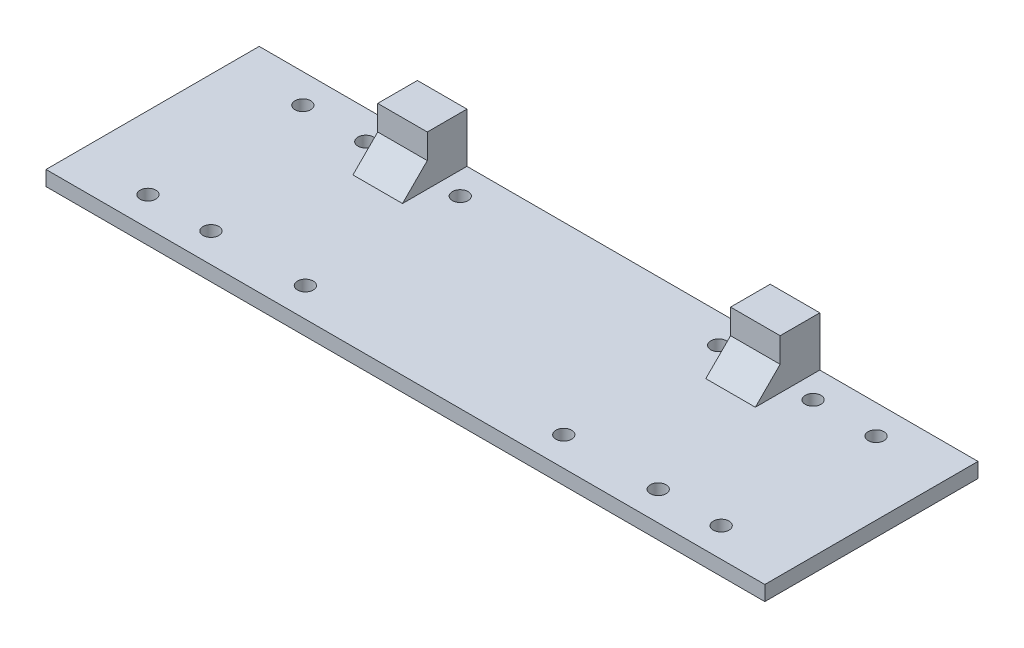
ISO-10303-21;
HEADER;
FILE_DESCRIPTION(('STEP AP214'),'2;1');
FILE_NAME('part.step','',(''),(''),'','','');
FILE_SCHEMA(('AUTOMOTIVE_DESIGN { 1 0 10303 214 1 1 1 1 }'));
ENDSEC;
DATA;
#1=APPLICATION_CONTEXT('core data for automotive mechanical design processes');
#2=APPLICATION_PROTOCOL_DEFINITION('international standard','automotive_design',2000,#1);
#3=PRODUCT_CONTEXT('',#1,'mechanical');
#4=PRODUCT('Part','Part','',(#3));
#5=PRODUCT_RELATED_PRODUCT_CATEGORY('part','',(#4));
#6=PRODUCT_DEFINITION_FORMATION('','',#4);
#7=PRODUCT_DEFINITION_CONTEXT('part definition',#1,'design');
#8=PRODUCT_DEFINITION('design','',#6,#7);
#9=PRODUCT_DEFINITION_SHAPE('','',#8);
#10=(LENGTH_UNIT() NAMED_UNIT(*) SI_UNIT(.MILLI.,.METRE.));
#11=(NAMED_UNIT(*) PLANE_ANGLE_UNIT() SI_UNIT($,.RADIAN.));
#12=(NAMED_UNIT(*) SI_UNIT($,.STERADIAN.) SOLID_ANGLE_UNIT());
#13=UNCERTAINTY_MEASURE_WITH_UNIT(LENGTH_MEASURE(1.E-05),#10,'distance_accuracy_value','');
#14=(GEOMETRIC_REPRESENTATION_CONTEXT(3) GLOBAL_UNCERTAINTY_ASSIGNED_CONTEXT((#13)) GLOBAL_UNIT_ASSIGNED_CONTEXT((#10,
#11,#12)) REPRESENTATION_CONTEXT('',''));
#15=CARTESIAN_POINT('',(0.,0.,0.));
#16=DIRECTION('',(0.,0.,1.));
#17=DIRECTION('',(1.,0.,0.));
#18=AXIS2_PLACEMENT_3D('',#15,#16,#17);
#19=CARTESIAN_POINT('',(0.,3.,0.));
#20=DIRECTION('',(0.,-1.,0.));
#21=DIRECTION('',(0.,0.,-1.));
#22=AXIS2_PLACEMENT_3D('',#19,#20,#21);
#23=PLANE('',#22);
#24=CARTESIAN_POINT('',(-57.8125,3.,-15.621));
#25=DIRECTION('',(0.,1.,0.));
#26=DIRECTION('',(0.,0.,1.));
#27=AXIS2_PLACEMENT_3D('',#24,#25,#26);
#28=CIRCLE('',#27,1.58749999999997);
#29=CARTESIAN_POINT('',(-57.8125,3.,-14.0335000000001));
#30=VERTEX_POINT('',#29);
#31=EDGE_CURVE('E272',#30,#30,#28,.T.);
#32=ORIENTED_EDGE('',*,*,#31,.F.);
#33=EDGE_LOOP('',(#32));
#34=FACE_BOUND('',#33,.T.);
#35=CARTESIAN_POINT('',(-45.1125,3.,-15.6210000000001));
#36=DIRECTION('',(0.,1.,0.));
#37=DIRECTION('',(0.,0.,1.));
#38=AXIS2_PLACEMENT_3D('',#35,#36,#37);
#39=CIRCLE('',#38,1.5875);
#40=CARTESIAN_POINT('',(-45.1125,3.,-14.0335000000001));
#41=VERTEX_POINT('',#40);
#42=EDGE_CURVE('E266',#41,#41,#39,.T.);
#43=ORIENTED_EDGE('',*,*,#42,.F.);
#44=EDGE_LOOP('',(#43));
#45=FACE_BOUND('',#44,.T.);
#46=CARTESIAN_POINT('',(-26.0625,3.,-15.621));
#47=DIRECTION('',(0.,1.,0.));
#48=DIRECTION('',(0.,0.,1.));
#49=AXIS2_PLACEMENT_3D('',#46,#47,#48);
#50=CIRCLE('',#49,1.5875);
#51=CARTESIAN_POINT('',(-26.0625,3.,-14.0335));
#52=VERTEX_POINT('',#51);
#53=EDGE_CURVE('E260',#52,#52,#50,.T.);
#54=ORIENTED_EDGE('',*,*,#53,.F.);
#55=EDGE_LOOP('',(#54));
#56=FACE_BOUND('',#55,.T.);
#57=CARTESIAN_POINT('',(-26.0624999999999,3.,15.6209999999999));
#58=DIRECTION('',(0.,1.,0.));
#59=DIRECTION('',(0.,0.,1.));
#60=AXIS2_PLACEMENT_3D('',#57,#58,#59);
#61=CIRCLE('',#60,1.5875);
#62=CARTESIAN_POINT('',(-26.0624999999999,3.,17.2084999999999));
#63=VERTEX_POINT('',#62);
#64=EDGE_CURVE('E254',#63,#63,#61,.T.);
#65=ORIENTED_EDGE('',*,*,#64,.F.);
#66=EDGE_LOOP('',(#65));
#67=FACE_BOUND('',#66,.T.);
#68=CARTESIAN_POINT('',(45.1124999999999,3.,15.6209999999999));
#69=DIRECTION('',(0.,1.,0.));
#70=DIRECTION('',(0.,0.,-1.));
#71=AXIS2_PLACEMENT_3D('',#68,#69,#70);
#72=CIRCLE('',#71,1.5875);
#73=CARTESIAN_POINT('',(45.1124999999999,3.,14.0334999999999));
#74=VERTEX_POINT('',#73);
#75=EDGE_CURVE('E248',#74,#74,#72,.T.);
#76=ORIENTED_EDGE('',*,*,#75,.F.);
#77=EDGE_LOOP('',(#76));
#78=FACE_BOUND('',#77,.T.);
#79=CARTESIAN_POINT('',(-45.1124999999999,3.,15.6209999999999));
#80=DIRECTION('',(0.,1.,0.));
#81=DIRECTION('',(0.,0.,1.));
#82=AXIS2_PLACEMENT_3D('',#79,#80,#81);
#83=CIRCLE('',#82,1.5875);
#84=CARTESIAN_POINT('',(-45.1124999999999,3.,17.2084999999999));
#85=VERTEX_POINT('',#84);
#86=EDGE_CURVE('E242',#85,#85,#83,.T.);
#87=ORIENTED_EDGE('',*,*,#86,.F.);
#88=EDGE_LOOP('',(#87));
#89=FACE_BOUND('',#88,.T.);
#90=CARTESIAN_POINT('',(26.0624999999999,3.,15.6209999999999));
#91=DIRECTION('',(0.,1.,0.));
#92=DIRECTION('',(0.,0.,-1.));
#93=AXIS2_PLACEMENT_3D('',#90,#91,#92);
#94=CIRCLE('',#93,1.5875);
#95=CARTESIAN_POINT('',(26.0624999999999,3.,14.0334999999999));
#96=VERTEX_POINT('',#95);
#97=EDGE_CURVE('E236',#96,#96,#94,.T.);
#98=ORIENTED_EDGE('',*,*,#97,.F.);
#99=EDGE_LOOP('',(#98));
#100=FACE_BOUND('',#99,.T.);
#101=CARTESIAN_POINT('',(-57.8124999999999,3.,15.621));
#102=DIRECTION('',(0.,1.,0.));
#103=DIRECTION('',(0.,0.,1.));
#104=AXIS2_PLACEMENT_3D('',#101,#102,#103);
#105=CIRCLE('',#104,1.5875);
#106=CARTESIAN_POINT('',(-57.8124999999999,3.,17.2085));
#107=VERTEX_POINT('',#106);
#108=EDGE_CURVE('E230',#107,#107,#105,.T.);
#109=ORIENTED_EDGE('',*,*,#108,.F.);
#110=EDGE_LOOP('',(#109));
#111=FACE_BOUND('',#110,.T.);
#112=CARTESIAN_POINT('',(26.0625,3.,-15.621));
#113=DIRECTION('',(0.,1.,0.));
#114=DIRECTION('',(0.,0.,-1.));
#115=AXIS2_PLACEMENT_3D('',#112,#113,#114);
#116=CIRCLE('',#115,1.5875);
#117=CARTESIAN_POINT('',(26.0625,3.,-17.2085));
#118=VERTEX_POINT('',#117);
#119=EDGE_CURVE('E224',#118,#118,#116,.T.);
#120=ORIENTED_EDGE('',*,*,#119,.F.);
#121=EDGE_LOOP('',(#120));
#122=FACE_BOUND('',#121,.T.);
#123=CARTESIAN_POINT('',(45.1125,3.,-15.6210000000001));
#124=DIRECTION('',(0.,1.,0.));
#125=DIRECTION('',(0.,0.,-1.));
#126=AXIS2_PLACEMENT_3D('',#123,#124,#125);
#127=CIRCLE('',#126,1.5875);
#128=CARTESIAN_POINT('',(45.1125,3.,-17.2085000000001));
#129=VERTEX_POINT('',#128);
#130=EDGE_CURVE('E218',#129,#129,#127,.T.);
#131=ORIENTED_EDGE('',*,*,#130,.F.);
#132=EDGE_LOOP('',(#131));
#133=FACE_BOUND('',#132,.T.);
#134=CARTESIAN_POINT('',(57.8125,3.,-15.621));
#135=DIRECTION('',(0.,1.,0.));
#136=DIRECTION('',(0.,0.,-1.));
#137=AXIS2_PLACEMENT_3D('',#134,#135,#136);
#138=CIRCLE('',#137,1.58749999999997);
#139=CARTESIAN_POINT('',(57.8125,3.,-17.2085));
#140=VERTEX_POINT('',#139);
#141=EDGE_CURVE('E212',#140,#140,#138,.T.);
#142=ORIENTED_EDGE('',*,*,#141,.F.);
#143=EDGE_LOOP('',(#142));
#144=FACE_BOUND('',#143,.T.);
#145=CARTESIAN_POINT('',(57.8124999999999,3.,15.621));
#146=DIRECTION('',(0.,1.,0.));
#147=DIRECTION('',(0.,0.,-1.));
#148=AXIS2_PLACEMENT_3D('',#145,#146,#147);
#149=CIRCLE('',#148,1.5875);
#150=CARTESIAN_POINT('',(57.8124999999999,3.,14.0335));
#151=VERTEX_POINT('',#150);
#152=EDGE_CURVE('E206',#151,#151,#149,.T.);
#153=ORIENTED_EDGE('',*,*,#152,.F.);
#154=EDGE_LOOP('',(#153));
#155=FACE_BOUND('',#154,.T.);
#156=DIRECTION('',(0.,0.,-1.));
#157=VECTOR('',#156,1.);
#158=CARTESIAN_POINT('',(40.5875,3.,-13.5));
#159=LINE('',#158,#157);
#160=CARTESIAN_POINT('',(40.5875,3.,-8.50000000000003));
#161=VERTEX_POINT('',#160);
#162=CARTESIAN_POINT('',(40.5875,3.,-21.5));
#163=VERTEX_POINT('',#162);
#164=EDGE_CURVE('E162',#161,#163,#159,.T.);
#165=ORIENTED_EDGE('',*,*,#164,.F.);
#166=DIRECTION('',(-1.,0.,0.));
#167=VECTOR('',#166,1.);
#168=CARTESIAN_POINT('',(30.5875,3.,-8.50000000000003));
#169=LINE('',#168,#167);
#170=CARTESIAN_POINT('',(30.5875,3.,-8.50000000000003));
#171=VERTEX_POINT('',#170);
#172=EDGE_CURVE('E158',#161,#171,#169,.T.);
#173=ORIENTED_EDGE('',*,*,#172,.T.);
#174=DIRECTION('',(0.,0.,1.));
#175=VECTOR('',#174,1.);
#176=CARTESIAN_POINT('',(30.5875,3.,-13.5));
#177=LINE('',#176,#175);
#178=CARTESIAN_POINT('',(30.5875,3.,-21.5));
#179=VERTEX_POINT('',#178);
#180=EDGE_CURVE('E156',#179,#171,#177,.T.);
#181=ORIENTED_EDGE('',*,*,#180,.F.);
#182=DIRECTION('',(-1.,0.,0.));
#183=VECTOR('',#182,1.);
#184=CARTESIAN_POINT('',(-72.5,3.,-21.5));
#185=LINE('',#184,#183);
#186=CARTESIAN_POINT('',(-30.5875,3.,-21.5));
#187=VERTEX_POINT('',#186);
#188=EDGE_CURVE('E140',#179,#187,#185,.T.);
#189=ORIENTED_EDGE('',*,*,#188,.T.);
#190=DIRECTION('',(0.,0.,-1.));
#191=VECTOR('',#190,1.);
#192=CARTESIAN_POINT('',(-30.5875,3.,-13.5));
#193=LINE('',#192,#191);
#194=CARTESIAN_POINT('',(-30.5875,3.,-8.50000000000003));
#195=VERTEX_POINT('',#194);
#196=EDGE_CURVE('E188',#195,#187,#193,.T.);
#197=ORIENTED_EDGE('',*,*,#196,.F.);
#198=DIRECTION('',(-1.,0.,0.));
#199=VECTOR('',#198,1.);
#200=CARTESIAN_POINT('',(-40.5875,3.,-8.50000000000003));
#201=LINE('',#200,#199);
#202=CARTESIAN_POINT('',(-40.5875,3.,-8.50000000000003));
#203=VERTEX_POINT('',#202);
#204=EDGE_CURVE('E308',#195,#203,#201,.T.);
#205=ORIENTED_EDGE('',*,*,#204,.T.);
#206=DIRECTION('',(0.,0.,1.));
#207=VECTOR('',#206,1.);
#208=CARTESIAN_POINT('',(-40.5875,3.,-13.5));
#209=LINE('',#208,#207);
#210=CARTESIAN_POINT('',(-40.5875,3.,-21.5));
#211=VERTEX_POINT('',#210);
#212=EDGE_CURVE('E161',#211,#203,#209,.T.);
#213=ORIENTED_EDGE('',*,*,#212,.F.);
#214=CARTESIAN_POINT('',(-72.5,3.,-21.5));
#215=VERTEX_POINT('',#214);
#216=EDGE_CURVE('E153',#211,#215,#185,.T.);
#217=ORIENTED_EDGE('',*,*,#216,.T.);
#218=DIRECTION('',(0.,0.,1.));
#219=VECTOR('',#218,1.);
#220=CARTESIAN_POINT('',(-72.5,3.,21.5));
#221=LINE('',#220,#219);
#222=CARTESIAN_POINT('',(-72.5,3.,21.5));
#223=VERTEX_POINT('',#222);
#224=EDGE_CURVE('E282',#215,#223,#221,.T.);
#225=ORIENTED_EDGE('',*,*,#224,.T.);
#226=DIRECTION('',(1.,0.,0.));
#227=VECTOR('',#226,1.);
#228=CARTESIAN_POINT('',(-72.5,3.,21.5));
#229=LINE('',#228,#227);
#230=CARTESIAN_POINT('',(72.5,3.,21.5));
#231=VERTEX_POINT('',#230);
#232=EDGE_CURVE('E284',#223,#231,#229,.T.);
#233=ORIENTED_EDGE('',*,*,#232,.T.);
#234=DIRECTION('',(0.,0.,-1.));
#235=VECTOR('',#234,1.);
#236=CARTESIAN_POINT('',(72.5,3.,21.5));
#237=LINE('',#236,#235);
#238=CARTESIAN_POINT('',(72.5,3.,-21.5));
#239=VERTEX_POINT('',#238);
#240=EDGE_CURVE('E278',#231,#239,#237,.T.);
#241=ORIENTED_EDGE('',*,*,#240,.T.);
#242=EDGE_CURVE('E152',#239,#163,#185,.T.);
#243=ORIENTED_EDGE('',*,*,#242,.T.);
#244=EDGE_LOOP('',(#165,#173,#181,#189,#197,#205,#213,#217,#225,#233,#241,#243));
#245=FACE_BOUND('',#244,.T.);
#246=ADVANCED_FACE('F38',(#34,#45,#56,#67,#78,#89,#100,#111,#122,#133,#144,#155,#245),#23,.F.);
#247=CARTESIAN_POINT('',(0.,0.,0.));
#248=DIRECTION('',(0.,-1.,0.));
#249=DIRECTION('',(0.,0.,-1.));
#250=AXIS2_PLACEMENT_3D('',#247,#248,#249);
#251=PLANE('',#250);
#252=CARTESIAN_POINT('',(57.8125,0.,-15.621));
#253=DIRECTION('',(0.,1.,0.));
#254=DIRECTION('',(0.,0.,-1.));
#255=AXIS2_PLACEMENT_3D('',#252,#253,#254);
#256=CIRCLE('',#255,1.58749999999997);
#257=CARTESIAN_POINT('',(57.8125,0.,-17.2085));
#258=VERTEX_POINT('',#257);
#259=EDGE_CURVE('E209',#258,#258,#256,.T.);
#260=ORIENTED_EDGE('',*,*,#259,.T.);
#261=EDGE_LOOP('',(#260));
#262=FACE_BOUND('',#261,.T.);
#263=CARTESIAN_POINT('',(26.0625,0.,-15.621));
#264=DIRECTION('',(0.,1.,0.));
#265=DIRECTION('',(0.,0.,-1.));
#266=AXIS2_PLACEMENT_3D('',#263,#264,#265);
#267=CIRCLE('',#266,1.5875);
#268=CARTESIAN_POINT('',(26.0625,0.,-17.2085));
#269=VERTEX_POINT('',#268);
#270=EDGE_CURVE('E221',#269,#269,#267,.T.);
#271=ORIENTED_EDGE('',*,*,#270,.T.);
#272=EDGE_LOOP('',(#271));
#273=FACE_BOUND('',#272,.T.);
#274=CARTESIAN_POINT('',(26.0624999999999,0.,15.6209999999999));
#275=DIRECTION('',(0.,1.,0.));
#276=DIRECTION('',(0.,0.,-1.));
#277=AXIS2_PLACEMENT_3D('',#274,#275,#276);
#278=CIRCLE('',#277,1.5875);
#279=CARTESIAN_POINT('',(26.0624999999999,0.,14.0334999999999));
#280=VERTEX_POINT('',#279);
#281=EDGE_CURVE('E233',#280,#280,#278,.T.);
#282=ORIENTED_EDGE('',*,*,#281,.T.);
#283=EDGE_LOOP('',(#282));
#284=FACE_BOUND('',#283,.T.);
#285=CARTESIAN_POINT('',(45.1124999999999,0.,15.6209999999999));
#286=DIRECTION('',(0.,1.,0.));
#287=DIRECTION('',(0.,0.,-1.));
#288=AXIS2_PLACEMENT_3D('',#285,#286,#287);
#289=CIRCLE('',#288,1.5875);
#290=CARTESIAN_POINT('',(45.1124999999999,0.,14.0334999999999));
#291=VERTEX_POINT('',#290);
#292=EDGE_CURVE('E245',#291,#291,#289,.T.);
#293=ORIENTED_EDGE('',*,*,#292,.T.);
#294=EDGE_LOOP('',(#293));
#295=FACE_BOUND('',#294,.T.);
#296=CARTESIAN_POINT('',(-26.0625,0.,-15.621));
#297=DIRECTION('',(0.,1.,0.));
#298=DIRECTION('',(0.,0.,1.));
#299=AXIS2_PLACEMENT_3D('',#296,#297,#298);
#300=CIRCLE('',#299,1.5875);
#301=CARTESIAN_POINT('',(-26.0625,0.,-14.0335));
#302=VERTEX_POINT('',#301);
#303=EDGE_CURVE('E257',#302,#302,#300,.T.);
#304=ORIENTED_EDGE('',*,*,#303,.T.);
#305=EDGE_LOOP('',(#304));
#306=FACE_BOUND('',#305,.T.);
#307=CARTESIAN_POINT('',(-57.8125,0.,-15.621));
#308=DIRECTION('',(0.,1.,0.));
#309=DIRECTION('',(0.,0.,1.));
#310=AXIS2_PLACEMENT_3D('',#307,#308,#309);
#311=CIRCLE('',#310,1.58749999999997);
#312=CARTESIAN_POINT('',(-57.8125,0.,-14.0335000000001));
#313=VERTEX_POINT('',#312);
#314=EDGE_CURVE('E269',#313,#313,#311,.T.);
#315=ORIENTED_EDGE('',*,*,#314,.T.);
#316=EDGE_LOOP('',(#315));
#317=FACE_BOUND('',#316,.T.);
#318=DIRECTION('',(0.,0.,-1.));
#319=VECTOR('',#318,1.);
#320=CARTESIAN_POINT('',(72.5,0.,21.5));
#321=LINE('',#320,#319);
#322=CARTESIAN_POINT('',(72.5,0.,21.5));
#323=VERTEX_POINT('',#322);
#324=CARTESIAN_POINT('',(72.5,0.,-21.5));
#325=VERTEX_POINT('',#324);
#326=EDGE_CURVE('E275',#323,#325,#321,.T.);
#327=ORIENTED_EDGE('',*,*,#326,.F.);
#328=DIRECTION('',(1.,0.,0.));
#329=VECTOR('',#328,1.);
#330=CARTESIAN_POINT('',(-72.5,0.,21.5));
#331=LINE('',#330,#329);
#332=CARTESIAN_POINT('',(-72.5,0.,21.5));
#333=VERTEX_POINT('',#332);
#334=EDGE_CURVE('E280',#333,#323,#331,.T.);
#335=ORIENTED_EDGE('',*,*,#334,.F.);
#336=DIRECTION('',(0.,0.,1.));
#337=VECTOR('',#336,1.);
#338=CARTESIAN_POINT('',(-72.5,0.,21.5));
#339=LINE('',#338,#337);
#340=CARTESIAN_POINT('',(-72.5,0.,-21.5));
#341=VERTEX_POINT('',#340);
#342=EDGE_CURVE('E291',#341,#333,#339,.T.);
#343=ORIENTED_EDGE('',*,*,#342,.F.);
#344=DIRECTION('',(-1.,0.,0.));
#345=VECTOR('',#344,1.);
#346=CARTESIAN_POINT('',(-72.5,0.,-21.5));
#347=LINE('',#346,#345);
#348=EDGE_CURVE('E289',#325,#341,#347,.T.);
#349=ORIENTED_EDGE('',*,*,#348,.F.);
#350=EDGE_LOOP('',(#327,#335,#343,#349));
#351=FACE_BOUND('',#350,.T.);
#352=CARTESIAN_POINT('',(-45.1125,0.,-15.6210000000001));
#353=DIRECTION('',(0.,1.,0.));
#354=DIRECTION('',(0.,0.,1.));
#355=AXIS2_PLACEMENT_3D('',#352,#353,#354);
#356=CIRCLE('',#355,1.5875);
#357=CARTESIAN_POINT('',(-45.1125,0.,-14.0335000000001));
#358=VERTEX_POINT('',#357);
#359=EDGE_CURVE('E263',#358,#358,#356,.T.);
#360=ORIENTED_EDGE('',*,*,#359,.T.);
#361=EDGE_LOOP('',(#360));
#362=FACE_BOUND('',#361,.T.);
#363=CARTESIAN_POINT('',(-26.0624999999999,0.,15.6209999999999));
#364=DIRECTION('',(0.,1.,0.));
#365=DIRECTION('',(0.,0.,1.));
#366=AXIS2_PLACEMENT_3D('',#363,#364,#365);
#367=CIRCLE('',#366,1.5875);
#368=CARTESIAN_POINT('',(-26.0624999999999,0.,17.2084999999999));
#369=VERTEX_POINT('',#368);
#370=EDGE_CURVE('E251',#369,#369,#367,.T.);
#371=ORIENTED_EDGE('',*,*,#370,.T.);
#372=EDGE_LOOP('',(#371));
#373=FACE_BOUND('',#372,.T.);
#374=CARTESIAN_POINT('',(-45.1124999999999,0.,15.6209999999999));
#375=DIRECTION('',(0.,1.,0.));
#376=DIRECTION('',(0.,0.,1.));
#377=AXIS2_PLACEMENT_3D('',#374,#375,#376);
#378=CIRCLE('',#377,1.5875);
#379=CARTESIAN_POINT('',(-45.1124999999999,0.,17.2084999999999));
#380=VERTEX_POINT('',#379);
#381=EDGE_CURVE('E239',#380,#380,#378,.T.);
#382=ORIENTED_EDGE('',*,*,#381,.T.);
#383=EDGE_LOOP('',(#382));
#384=FACE_BOUND('',#383,.T.);
#385=CARTESIAN_POINT('',(-57.8124999999999,0.,15.621));
#386=DIRECTION('',(0.,1.,0.));
#387=DIRECTION('',(0.,0.,1.));
#388=AXIS2_PLACEMENT_3D('',#385,#386,#387);
#389=CIRCLE('',#388,1.5875);
#390=CARTESIAN_POINT('',(-57.8124999999999,0.,17.2085));
#391=VERTEX_POINT('',#390);
#392=EDGE_CURVE('E227',#391,#391,#389,.T.);
#393=ORIENTED_EDGE('',*,*,#392,.T.);
#394=EDGE_LOOP('',(#393));
#395=FACE_BOUND('',#394,.T.);
#396=CARTESIAN_POINT('',(45.1125,0.,-15.6210000000001));
#397=DIRECTION('',(0.,1.,0.));
#398=DIRECTION('',(0.,0.,-1.));
#399=AXIS2_PLACEMENT_3D('',#396,#397,#398);
#400=CIRCLE('',#399,1.5875);
#401=CARTESIAN_POINT('',(45.1125,0.,-17.2085000000001));
#402=VERTEX_POINT('',#401);
#403=EDGE_CURVE('E215',#402,#402,#400,.T.);
#404=ORIENTED_EDGE('',*,*,#403,.T.);
#405=EDGE_LOOP('',(#404));
#406=FACE_BOUND('',#405,.T.);
#407=CARTESIAN_POINT('',(57.8124999999999,0.,15.621));
#408=DIRECTION('',(0.,1.,0.));
#409=DIRECTION('',(0.,0.,-1.));
#410=AXIS2_PLACEMENT_3D('',#407,#408,#409);
#411=CIRCLE('',#410,1.5875);
#412=CARTESIAN_POINT('',(57.8124999999999,0.,14.0335));
#413=VERTEX_POINT('',#412);
#414=EDGE_CURVE('E205',#413,#413,#411,.T.);
#415=ORIENTED_EDGE('',*,*,#414,.T.);
#416=EDGE_LOOP('',(#415));
#417=FACE_BOUND('',#416,.T.);
#418=ADVANCED_FACE('F342',(#262,#273,#284,#295,#306,#317,#351,#362,#373,#384,#395,#406,#417),
#251,.T.);
#419=CARTESIAN_POINT('',(72.5,3.,21.5));
#420=DIRECTION('',(-1.,0.,0.));
#421=DIRECTION('',(0.,0.,1.));
#422=AXIS2_PLACEMENT_3D('',#419,#420,#421);
#423=PLANE('',#422);
#424=ORIENTED_EDGE('',*,*,#326,.T.);
#425=DIRECTION('',(0.,-1.,0.));
#426=VECTOR('',#425,1.);
#427=CARTESIAN_POINT('',(72.5,3.,-21.5));
#428=LINE('',#427,#426);
#429=EDGE_CURVE('E302',#239,#325,#428,.T.);
#430=ORIENTED_EDGE('',*,*,#429,.F.);
#431=ORIENTED_EDGE('',*,*,#240,.F.);
#432=DIRECTION('',(0.,-1.,0.));
#433=VECTOR('',#432,1.);
#434=CARTESIAN_POINT('',(72.5,3.,21.5));
#435=LINE('',#434,#433);
#436=EDGE_CURVE('E286',#231,#323,#435,.T.);
#437=ORIENTED_EDGE('',*,*,#436,.T.);
#438=EDGE_LOOP('',(#424,#430,#431,#437));
#439=FACE_BOUND('',#438,.T.);
#440=ADVANCED_FACE('F348',(#439),#423,.F.);
#441=CARTESIAN_POINT('',(-72.5,3.,-21.5));
#442=DIRECTION('',(0.,0.,1.));
#443=DIRECTION('',(1.,0.,0.));
#444=AXIS2_PLACEMENT_3D('',#441,#442,#443);
#445=PLANE('',#444);
#446=CARTESIAN_POINT('',(35.5875,6.5,-21.5));
#447=DIRECTION('',(0.,0.,-1.));
#448=DIRECTION('',(-1.,0.,0.));
#449=AXIS2_PLACEMENT_3D('',#446,#447,#448);
#450=CIRCLE('',#449,2.2);
#451=CARTESIAN_POINT('',(33.3875,6.5,-21.5));
#452=VERTEX_POINT('',#451);
#453=EDGE_CURVE('E395',#452,#452,#450,.T.);
#454=ORIENTED_EDGE('',*,*,#453,.F.);
#455=EDGE_LOOP('',(#454));
#456=FACE_BOUND('',#455,.T.);
#457=CARTESIAN_POINT('',(-35.5875,6.5,-21.5));
#458=DIRECTION('',(0.,0.,-1.));
#459=DIRECTION('',(-1.,0.,0.));
#460=AXIS2_PLACEMENT_3D('',#457,#458,#459);
#461=CIRCLE('',#460,2.2);
#462=CARTESIAN_POINT('',(-37.7875,6.5,-21.5));
#463=VERTEX_POINT('',#462);
#464=EDGE_CURVE('E401',#463,#463,#461,.T.);
#465=ORIENTED_EDGE('',*,*,#464,.F.);
#466=EDGE_LOOP('',(#465));
#467=FACE_BOUND('',#466,.T.);
#468=ORIENTED_EDGE('',*,*,#348,.T.);
#469=DIRECTION('',(0.,-1.,0.));
#470=VECTOR('',#469,1.);
#471=CARTESIAN_POINT('',(-72.5,3.,-21.5));
#472=LINE('',#471,#470);
#473=EDGE_CURVE('E299',#215,#341,#472,.T.);
#474=ORIENTED_EDGE('',*,*,#473,.F.);
#475=ORIENTED_EDGE('',*,*,#216,.F.);
#476=DIRECTION('',(0.,-1.,0.));
#477=VECTOR('',#476,1.);
#478=CARTESIAN_POINT('',(-40.5875,13.,-21.5));
#479=LINE('',#478,#477);
#480=CARTESIAN_POINT('',(-40.5875,13.,-21.5));
#481=VERTEX_POINT('',#480);
#482=EDGE_CURVE('E194',#481,#211,#479,.T.);
#483=ORIENTED_EDGE('',*,*,#482,.F.);
#484=DIRECTION('',(-1.,0.,0.));
#485=VECTOR('',#484,1.);
#486=CARTESIAN_POINT('',(-30.5875,13.,-21.5));
#487=LINE('',#486,#485);
#488=CARTESIAN_POINT('',(-30.5875,13.,-21.5));
#489=VERTEX_POINT('',#488);
#490=EDGE_CURVE('E192',#489,#481,#487,.T.);
#491=ORIENTED_EDGE('',*,*,#490,.F.);
#492=DIRECTION('',(0.,-1.,0.));
#493=VECTOR('',#492,1.);
#494=CARTESIAN_POINT('',(-30.5875,13.,-21.5));
#495=LINE('',#494,#493);
#496=EDGE_CURVE('E149',#489,#187,#495,.T.);
#497=ORIENTED_EDGE('',*,*,#496,.T.);
#498=ORIENTED_EDGE('',*,*,#188,.F.);
#499=DIRECTION('',(0.,-1.,0.));
#500=VECTOR('',#499,1.);
#501=CARTESIAN_POINT('',(30.5875,13.,-21.5));
#502=LINE('',#501,#500);
#503=CARTESIAN_POINT('',(30.5875,13.,-21.5));
#504=VERTEX_POINT('',#503);
#505=EDGE_CURVE('E145',#504,#179,#502,.T.);
#506=ORIENTED_EDGE('',*,*,#505,.F.);
#507=DIRECTION('',(-1.,0.,0.));
#508=VECTOR('',#507,1.);
#509=CARTESIAN_POINT('',(30.5875,13.,-21.5));
#510=LINE('',#509,#508);
#511=CARTESIAN_POINT('',(40.5875,13.,-21.5));
#512=VERTEX_POINT('',#511);
#513=EDGE_CURVE('E168',#512,#504,#510,.T.);
#514=ORIENTED_EDGE('',*,*,#513,.F.);
#515=DIRECTION('',(0.,-1.,0.));
#516=VECTOR('',#515,1.);
#517=CARTESIAN_POINT('',(40.5875,13.,-21.5));
#518=LINE('',#517,#516);
#519=EDGE_CURVE('E169',#512,#163,#518,.T.);
#520=ORIENTED_EDGE('',*,*,#519,.T.);
#521=ORIENTED_EDGE('',*,*,#242,.F.);
#522=ORIENTED_EDGE('',*,*,#429,.T.);
#523=EDGE_LOOP('',(#468,#474,#475,#483,#491,#497,#498,#506,#514,#520,#521,#522));
#524=FACE_BOUND('',#523,.T.);
#525=ADVANCED_FACE('F142',(#456,#467,#524),#445,.F.);
#526=CARTESIAN_POINT('',(-72.5,3.,21.5));
#527=DIRECTION('',(1.,0.,0.));
#528=DIRECTION('',(0.,0.,-1.));
#529=AXIS2_PLACEMENT_3D('',#526,#527,#528);
#530=PLANE('',#529);
#531=ORIENTED_EDGE('',*,*,#342,.T.);
#532=DIRECTION('',(0.,-1.,0.));
#533=VECTOR('',#532,1.);
#534=CARTESIAN_POINT('',(-72.5,3.,21.5));
#535=LINE('',#534,#533);
#536=EDGE_CURVE('E296',#223,#333,#535,.T.);
#537=ORIENTED_EDGE('',*,*,#536,.F.);
#538=ORIENTED_EDGE('',*,*,#224,.F.);
#539=ORIENTED_EDGE('',*,*,#473,.T.);
#540=EDGE_LOOP('',(#531,#537,#538,#539));
#541=FACE_BOUND('',#540,.T.);
#542=ADVANCED_FACE('F360',(#541),#530,.F.);
#543=CARTESIAN_POINT('',(-72.5,3.,21.5));
#544=DIRECTION('',(0.,0.,-1.));
#545=DIRECTION('',(-1.,0.,0.));
#546=AXIS2_PLACEMENT_3D('',#543,#544,#545);
#547=PLANE('',#546);
#548=ORIENTED_EDGE('',*,*,#334,.T.);
#549=ORIENTED_EDGE('',*,*,#436,.F.);
#550=ORIENTED_EDGE('',*,*,#232,.F.);
#551=ORIENTED_EDGE('',*,*,#536,.T.);
#552=EDGE_LOOP('',(#548,#549,#550,#551));
#553=FACE_BOUND('',#552,.T.);
#554=ADVANCED_FACE('F357',(#553),#547,.F.);
#555=CARTESIAN_POINT('',(-57.8125,3.,-15.621));
#556=DIRECTION('',(0.,-1.,0.));
#557=DIRECTION('',(0.,0.,-1.));
#558=AXIS2_PLACEMENT_3D('',#555,#556,#557);
#559=CYLINDRICAL_SURFACE('',#558,1.58749999999997);
#560=ORIENTED_EDGE('',*,*,#31,.T.);
#561=EDGE_LOOP('',(#560));
#562=FACE_BOUND('',#561,.T.);
#563=ORIENTED_EDGE('',*,*,#314,.F.);
#564=EDGE_LOOP('',(#563));
#565=FACE_BOUND('',#564,.T.);
#566=ADVANCED_FACE('F354',(#562,#565),#559,.F.);
#567=CARTESIAN_POINT('',(-45.1125,3.,-15.6210000000001));
#568=DIRECTION('',(0.,-1.,0.));
#569=DIRECTION('',(0.,0.,-1.));
#570=AXIS2_PLACEMENT_3D('',#567,#568,#569);
#571=CYLINDRICAL_SURFACE('',#570,1.5875);
#572=ORIENTED_EDGE('',*,*,#42,.T.);
#573=EDGE_LOOP('',(#572));
#574=FACE_BOUND('',#573,.T.);
#575=ORIENTED_EDGE('',*,*,#359,.F.);
#576=EDGE_LOOP('',(#575));
#577=FACE_BOUND('',#576,.T.);
#578=ADVANCED_FACE('F570',(#574,#577),#571,.F.);
#579=CARTESIAN_POINT('',(-26.0625,3.,-15.621));
#580=DIRECTION('',(0.,-1.,0.));
#581=DIRECTION('',(0.,0.,-1.));
#582=AXIS2_PLACEMENT_3D('',#579,#580,#581);
#583=CYLINDRICAL_SURFACE('',#582,1.5875);
#584=ORIENTED_EDGE('',*,*,#53,.T.);
#585=EDGE_LOOP('',(#584));
#586=FACE_BOUND('',#585,.T.);
#587=ORIENTED_EDGE('',*,*,#303,.F.);
#588=EDGE_LOOP('',(#587));
#589=FACE_BOUND('',#588,.T.);
#590=ADVANCED_FACE('F577',(#586,#589),#583,.F.);
#591=CARTESIAN_POINT('',(-26.0624999999999,3.,15.6209999999999));
#592=DIRECTION('',(0.,-1.,0.));
#593=DIRECTION('',(0.,0.,-1.));
#594=AXIS2_PLACEMENT_3D('',#591,#592,#593);
#595=CYLINDRICAL_SURFACE('',#594,1.5875);
#596=ORIENTED_EDGE('',*,*,#64,.T.);
#597=EDGE_LOOP('',(#596));
#598=FACE_BOUND('',#597,.T.);
#599=ORIENTED_EDGE('',*,*,#370,.F.);
#600=EDGE_LOOP('',(#599));
#601=FACE_BOUND('',#600,.T.);
#602=ADVANCED_FACE('F584',(#598,#601),#595,.F.);
#603=CARTESIAN_POINT('',(45.1124999999999,3.,15.6209999999999));
#604=DIRECTION('',(0.,-1.,0.));
#605=DIRECTION('',(0.,0.,-1.));
#606=AXIS2_PLACEMENT_3D('',#603,#604,#605);
#607=CYLINDRICAL_SURFACE('',#606,1.5875);
#608=ORIENTED_EDGE('',*,*,#75,.T.);
#609=EDGE_LOOP('',(#608));
#610=FACE_BOUND('',#609,.T.);
#611=ORIENTED_EDGE('',*,*,#292,.F.);
#612=EDGE_LOOP('',(#611));
#613=FACE_BOUND('',#612,.T.);
#614=ADVANCED_FACE('F592',(#610,#613),#607,.F.);
#615=CARTESIAN_POINT('',(-45.1124999999999,3.,15.6209999999999));
#616=DIRECTION('',(0.,-1.,0.));
#617=DIRECTION('',(0.,0.,-1.));
#618=AXIS2_PLACEMENT_3D('',#615,#616,#617);
#619=CYLINDRICAL_SURFACE('',#618,1.5875);
#620=ORIENTED_EDGE('',*,*,#86,.T.);
#621=EDGE_LOOP('',(#620));
#622=FACE_BOUND('',#621,.T.);
#623=ORIENTED_EDGE('',*,*,#381,.F.);
#624=EDGE_LOOP('',(#623));
#625=FACE_BOUND('',#624,.T.);
#626=ADVANCED_FACE('F600',(#622,#625),#619,.F.);
#627=CARTESIAN_POINT('',(26.0624999999999,3.,15.6209999999999));
#628=DIRECTION('',(0.,-1.,0.));
#629=DIRECTION('',(0.,0.,-1.));
#630=AXIS2_PLACEMENT_3D('',#627,#628,#629);
#631=CYLINDRICAL_SURFACE('',#630,1.5875);
#632=ORIENTED_EDGE('',*,*,#97,.T.);
#633=EDGE_LOOP('',(#632));
#634=FACE_BOUND('',#633,.T.);
#635=ORIENTED_EDGE('',*,*,#281,.F.);
#636=EDGE_LOOP('',(#635));
#637=FACE_BOUND('',#636,.T.);
#638=ADVANCED_FACE('F608',(#634,#637),#631,.F.);
#639=CARTESIAN_POINT('',(-57.8124999999999,3.,15.621));
#640=DIRECTION('',(0.,-1.,0.));
#641=DIRECTION('',(0.,0.,-1.));
#642=AXIS2_PLACEMENT_3D('',#639,#640,#641);
#643=CYLINDRICAL_SURFACE('',#642,1.5875);
#644=ORIENTED_EDGE('',*,*,#108,.T.);
#645=EDGE_LOOP('',(#644));
#646=FACE_BOUND('',#645,.T.);
#647=ORIENTED_EDGE('',*,*,#392,.F.);
#648=EDGE_LOOP('',(#647));
#649=FACE_BOUND('',#648,.T.);
#650=ADVANCED_FACE('F616',(#646,#649),#643,.F.);
#651=CARTESIAN_POINT('',(26.0625,3.,-15.621));
#652=DIRECTION('',(0.,-1.,0.));
#653=DIRECTION('',(0.,0.,-1.));
#654=AXIS2_PLACEMENT_3D('',#651,#652,#653);
#655=CYLINDRICAL_SURFACE('',#654,1.5875);
#656=ORIENTED_EDGE('',*,*,#119,.T.);
#657=EDGE_LOOP('',(#656));
#658=FACE_BOUND('',#657,.T.);
#659=ORIENTED_EDGE('',*,*,#270,.F.);
#660=EDGE_LOOP('',(#659));
#661=FACE_BOUND('',#660,.T.);
#662=ADVANCED_FACE('F624',(#658,#661),#655,.F.);
#663=CARTESIAN_POINT('',(45.1125,3.,-15.6210000000001));
#664=DIRECTION('',(0.,-1.,0.));
#665=DIRECTION('',(0.,0.,-1.));
#666=AXIS2_PLACEMENT_3D('',#663,#664,#665);
#667=CYLINDRICAL_SURFACE('',#666,1.5875);
#668=ORIENTED_EDGE('',*,*,#130,.T.);
#669=EDGE_LOOP('',(#668));
#670=FACE_BOUND('',#669,.T.);
#671=ORIENTED_EDGE('',*,*,#403,.F.);
#672=EDGE_LOOP('',(#671));
#673=FACE_BOUND('',#672,.T.);
#674=ADVANCED_FACE('F632',(#670,#673),#667,.F.);
#675=CARTESIAN_POINT('',(57.8125,3.,-15.621));
#676=DIRECTION('',(0.,-1.,0.));
#677=DIRECTION('',(0.,0.,-1.));
#678=AXIS2_PLACEMENT_3D('',#675,#676,#677);
#679=CYLINDRICAL_SURFACE('',#678,1.58749999999997);
#680=ORIENTED_EDGE('',*,*,#141,.T.);
#681=EDGE_LOOP('',(#680));
#682=FACE_BOUND('',#681,.T.);
#683=ORIENTED_EDGE('',*,*,#259,.F.);
#684=EDGE_LOOP('',(#683));
#685=FACE_BOUND('',#684,.T.);
#686=ADVANCED_FACE('F640',(#682,#685),#679,.F.);
#687=CARTESIAN_POINT('',(57.8124999999999,3.,15.621));
#688=DIRECTION('',(0.,-1.,0.));
#689=DIRECTION('',(0.,0.,-1.));
#690=AXIS2_PLACEMENT_3D('',#687,#688,#689);
#691=CYLINDRICAL_SURFACE('',#690,1.5875);
#692=ORIENTED_EDGE('',*,*,#152,.T.);
#693=EDGE_LOOP('',(#692));
#694=FACE_BOUND('',#693,.T.);
#695=ORIENTED_EDGE('',*,*,#414,.F.);
#696=EDGE_LOOP('',(#695));
#697=FACE_BOUND('',#696,.T.);
#698=ADVANCED_FACE('F339',(#694,#697),#691,.F.);
#699=CARTESIAN_POINT('',(-40.5875,13.,-13.5));
#700=DIRECTION('',(1.,0.,0.));
#701=DIRECTION('',(0.,0.,-1.));
#702=AXIS2_PLACEMENT_3D('',#699,#700,#701);
#703=PLANE('',#702);
#704=ORIENTED_EDGE('',*,*,#212,.T.);
#705=DIRECTION('',(0.,-0.707106781186551,0.707106781186544));
#706=VECTOR('',#705,1.);
#707=CARTESIAN_POINT('',(-40.5875,10.5,-16.));
#708=LINE('',#707,#706);
#709=CARTESIAN_POINT('',(-40.5875,8.00000000000003,-13.5));
#710=VERTEX_POINT('',#709);
#711=EDGE_CURVE('E11',#203,#710,#708,.F.);
#712=ORIENTED_EDGE('',*,*,#711,.T.);
#713=DIRECTION('',(0.,-1.,0.));
#714=VECTOR('',#713,1.);
#715=CARTESIAN_POINT('',(-40.5875,13.,-13.5));
#716=LINE('',#715,#714);
#717=CARTESIAN_POINT('',(-40.5875,13.,-13.5));
#718=VERTEX_POINT('',#717);
#719=EDGE_CURVE('E203',#718,#710,#716,.T.);
#720=ORIENTED_EDGE('',*,*,#719,.F.);
#721=DIRECTION('',(0.,0.,1.));
#722=VECTOR('',#721,1.);
#723=CARTESIAN_POINT('',(-40.5875,13.,-13.5));
#724=LINE('',#723,#722);
#725=EDGE_CURVE('E184',#481,#718,#724,.T.);
#726=ORIENTED_EDGE('',*,*,#725,.F.);
#727=ORIENTED_EDGE('',*,*,#482,.T.);
#728=EDGE_LOOP('',(#704,#712,#720,#726,#727));
#729=FACE_BOUND('',#728,.T.);
#730=ADVANCED_FACE('F327',(#729),#703,.F.);
#731=CARTESIAN_POINT('',(-30.5875,13.,-13.5));
#732=DIRECTION('',(0.,0.,-1.));
#733=DIRECTION('',(-1.,0.,0.));
#734=AXIS2_PLACEMENT_3D('',#731,#732,#733);
#735=PLANE('',#734);
#736=ORIENTED_EDGE('',*,*,#719,.T.);
#737=DIRECTION('',(1.,0.,0.));
#738=VECTOR('',#737,1.);
#739=CARTESIAN_POINT('',(-30.5875,8.00000000000003,-13.5));
#740=LINE('',#739,#738);
#741=CARTESIAN_POINT('',(-30.5875,8.00000000000003,-13.5));
#742=VERTEX_POINT('',#741);
#743=EDGE_CURVE('E312',#710,#742,#740,.T.);
#744=ORIENTED_EDGE('',*,*,#743,.T.);
#745=DIRECTION('',(0.,-1.,0.));
#746=VECTOR('',#745,1.);
#747=CARTESIAN_POINT('',(-30.5875,13.,-13.5));
#748=LINE('',#747,#746);
#749=CARTESIAN_POINT('',(-30.5875,13.,-13.5));
#750=VERTEX_POINT('',#749);
#751=EDGE_CURVE('E200',#750,#742,#748,.T.);
#752=ORIENTED_EDGE('',*,*,#751,.F.);
#753=DIRECTION('',(1.,0.,0.));
#754=VECTOR('',#753,1.);
#755=CARTESIAN_POINT('',(-30.5875,13.,-13.5));
#756=LINE('',#755,#754);
#757=EDGE_CURVE('E187',#718,#750,#756,.T.);
#758=ORIENTED_EDGE('',*,*,#757,.F.);
#759=EDGE_LOOP('',(#736,#744,#752,#758));
#760=FACE_BOUND('',#759,.T.);
#761=ADVANCED_FACE('F331',(#760),#735,.F.);
#762=CARTESIAN_POINT('',(-30.5875,13.,-13.5));
#763=DIRECTION('',(-1.,0.,0.));
#764=DIRECTION('',(0.,0.,1.));
#765=AXIS2_PLACEMENT_3D('',#762,#763,#764);
#766=PLANE('',#765);
#767=ORIENTED_EDGE('',*,*,#196,.T.);
#768=ORIENTED_EDGE('',*,*,#496,.F.);
#769=DIRECTION('',(0.,0.,-1.));
#770=VECTOR('',#769,1.);
#771=CARTESIAN_POINT('',(-30.5875,13.,-13.5));
#772=LINE('',#771,#770);
#773=EDGE_CURVE('E190',#750,#489,#772,.T.);
#774=ORIENTED_EDGE('',*,*,#773,.F.);
#775=ORIENTED_EDGE('',*,*,#751,.T.);
#776=DIRECTION('',(0.,0.707106781186551,-0.707106781186544));
#777=VECTOR('',#776,1.);
#778=CARTESIAN_POINT('',(-30.5875,10.5,-16.));
#779=LINE('',#778,#777);
#780=EDGE_CURVE('E47',#742,#195,#779,.F.);
#781=ORIENTED_EDGE('',*,*,#780,.T.);
#782=EDGE_LOOP('',(#767,#768,#774,#775,#781));
#783=FACE_BOUND('',#782,.T.);
#784=ADVANCED_FACE('F319',(#783),#766,.F.);
#785=CARTESIAN_POINT('',(0.,13.,0.));
#786=DIRECTION('',(0.,1.,0.));
#787=DIRECTION('',(0.,0.,1.));
#788=AXIS2_PLACEMENT_3D('',#785,#786,#787);
#789=PLANE('',#788);
#790=ORIENTED_EDGE('',*,*,#725,.T.);
#791=ORIENTED_EDGE('',*,*,#757,.T.);
#792=ORIENTED_EDGE('',*,*,#773,.T.);
#793=ORIENTED_EDGE('',*,*,#490,.T.);
#794=EDGE_LOOP('',(#790,#791,#792,#793));
#795=FACE_BOUND('',#794,.T.);
#796=ADVANCED_FACE('F329',(#795),#789,.T.);
#797=CARTESIAN_POINT('',(30.5875,13.,-13.5));
#798=DIRECTION('',(1.,0.,0.));
#799=DIRECTION('',(0.,0.,-1.));
#800=AXIS2_PLACEMENT_3D('',#797,#798,#799);
#801=PLANE('',#800);
#802=ORIENTED_EDGE('',*,*,#180,.T.);
#803=DIRECTION('',(0.,-0.707106781186551,0.707106781186544));
#804=VECTOR('',#803,1.);
#805=CARTESIAN_POINT('',(30.5875,10.5,-16.));
#806=LINE('',#805,#804);
#807=CARTESIAN_POINT('',(30.5875,8.00000000000003,-13.5));
#808=VERTEX_POINT('',#807);
#809=EDGE_CURVE('E317',#171,#808,#806,.F.);
#810=ORIENTED_EDGE('',*,*,#809,.T.);
#811=DIRECTION('',(0.,-1.,0.));
#812=VECTOR('',#811,1.);
#813=CARTESIAN_POINT('',(30.5875,13.,-13.5));
#814=LINE('',#813,#812);
#815=CARTESIAN_POINT('',(30.5875,13.,-13.5));
#816=VERTEX_POINT('',#815);
#817=EDGE_CURVE('E387',#816,#808,#814,.T.);
#818=ORIENTED_EDGE('',*,*,#817,.F.);
#819=DIRECTION('',(0.,0.,1.));
#820=VECTOR('',#819,1.);
#821=CARTESIAN_POINT('',(30.5875,13.,-13.5));
#822=LINE('',#821,#820);
#823=EDGE_CURVE('E167',#504,#816,#822,.T.);
#824=ORIENTED_EDGE('',*,*,#823,.F.);
#825=ORIENTED_EDGE('',*,*,#505,.T.);
#826=EDGE_LOOP('',(#802,#810,#818,#824,#825));
#827=FACE_BOUND('',#826,.T.);
#828=ADVANCED_FACE('F164',(#827),#801,.F.);
#829=CARTESIAN_POINT('',(30.5875,13.,-13.5));
#830=DIRECTION('',(0.,0.,-1.));
#831=DIRECTION('',(-1.,0.,0.));
#832=AXIS2_PLACEMENT_3D('',#829,#830,#831);
#833=PLANE('',#832);
#834=ORIENTED_EDGE('',*,*,#817,.T.);
#835=DIRECTION('',(1.,0.,0.));
#836=VECTOR('',#835,1.);
#837=CARTESIAN_POINT('',(40.5875,8.00000000000003,-13.5));
#838=LINE('',#837,#836);
#839=CARTESIAN_POINT('',(40.5875,8.00000000000003,-13.5));
#840=VERTEX_POINT('',#839);
#841=EDGE_CURVE('E305',#808,#840,#838,.T.);
#842=ORIENTED_EDGE('',*,*,#841,.T.);
#843=DIRECTION('',(0.,-1.,0.));
#844=VECTOR('',#843,1.);
#845=CARTESIAN_POINT('',(40.5875,13.,-13.5));
#846=LINE('',#845,#844);
#847=CARTESIAN_POINT('',(40.5875,13.,-13.5));
#848=VERTEX_POINT('',#847);
#849=EDGE_CURVE('E174',#848,#840,#846,.T.);
#850=ORIENTED_EDGE('',*,*,#849,.F.);
#851=DIRECTION('',(1.,0.,0.));
#852=VECTOR('',#851,1.);
#853=CARTESIAN_POINT('',(30.5875,13.,-13.5));
#854=LINE('',#853,#852);
#855=EDGE_CURVE('E181',#816,#848,#854,.T.);
#856=ORIENTED_EDGE('',*,*,#855,.F.);
#857=EDGE_LOOP('',(#834,#842,#850,#856));
#858=FACE_BOUND('',#857,.T.);
#859=ADVANCED_FACE('F389',(#858),#833,.F.);
#860=CARTESIAN_POINT('',(40.5875,13.,-13.5));
#861=DIRECTION('',(-1.,0.,0.));
#862=DIRECTION('',(0.,0.,1.));
#863=AXIS2_PLACEMENT_3D('',#860,#861,#862);
#864=PLANE('',#863);
#865=ORIENTED_EDGE('',*,*,#164,.T.);
#866=ORIENTED_EDGE('',*,*,#519,.F.);
#867=DIRECTION('',(0.,0.,-1.));
#868=VECTOR('',#867,1.);
#869=CARTESIAN_POINT('',(40.5875,13.,-13.5));
#870=LINE('',#869,#868);
#871=EDGE_CURVE('E171',#848,#512,#870,.T.);
#872=ORIENTED_EDGE('',*,*,#871,.F.);
#873=ORIENTED_EDGE('',*,*,#849,.T.);
#874=DIRECTION('',(0.,0.707106781186551,-0.707106781186544));
#875=VECTOR('',#874,1.);
#876=CARTESIAN_POINT('',(40.5875,10.5,-16.));
#877=LINE('',#876,#875);
#878=EDGE_CURVE('E314',#840,#161,#877,.F.);
#879=ORIENTED_EDGE('',*,*,#878,.T.);
#880=EDGE_LOOP('',(#865,#866,#872,#873,#879));
#881=FACE_BOUND('',#880,.T.);
#882=ADVANCED_FACE('F382',(#881),#864,.F.);
#883=CARTESIAN_POINT('',(0.,13.,0.));
#884=DIRECTION('',(0.,-1.,0.));
#885=DIRECTION('',(0.,0.,-1.));
#886=AXIS2_PLACEMENT_3D('',#883,#884,#885);
#887=PLANE('',#886);
#888=ORIENTED_EDGE('',*,*,#823,.T.);
#889=ORIENTED_EDGE('',*,*,#855,.T.);
#890=ORIENTED_EDGE('',*,*,#871,.T.);
#891=ORIENTED_EDGE('',*,*,#513,.T.);
#892=EDGE_LOOP('',(#888,#889,#890,#891));
#893=FACE_BOUND('',#892,.T.);
#894=ADVANCED_FACE('F375',(#893),#887,.F.);
#895=CARTESIAN_POINT('',(30.5875,8.00000000000003,-13.5));
#896=DIRECTION('',(0.,0.707106781186544,0.707106781186551));
#897=DIRECTION('',(-1.,0.,0.));
#898=AXIS2_PLACEMENT_3D('',#895,#896,#897);
#899=PLANE('',#898);
#900=ORIENTED_EDGE('',*,*,#809,.F.);
#901=ORIENTED_EDGE('',*,*,#172,.F.);
#902=ORIENTED_EDGE('',*,*,#878,.F.);
#903=ORIENTED_EDGE('',*,*,#841,.F.);
#904=EDGE_LOOP('',(#900,#901,#902,#903));
#905=FACE_BOUND('',#904,.T.);
#906=ADVANCED_FACE('F371',(#905),#899,.T.);
#907=CARTESIAN_POINT('',(-30.5875,8.00000000000003,-13.5));
#908=DIRECTION('',(0.,0.707106781186544,0.707106781186551));
#909=DIRECTION('',(-1.,0.,0.));
#910=AXIS2_PLACEMENT_3D('',#907,#908,#909);
#911=PLANE('',#910);
#912=ORIENTED_EDGE('',*,*,#711,.F.);
#913=ORIENTED_EDGE('',*,*,#204,.F.);
#914=ORIENTED_EDGE('',*,*,#780,.F.);
#915=ORIENTED_EDGE('',*,*,#743,.F.);
#916=EDGE_LOOP('',(#912,#913,#914,#915));
#917=FACE_BOUND('',#916,.T.);
#918=ADVANCED_FACE('F41',(#917),#911,.T.);
#919=CARTESIAN_POINT('',(-35.5875,6.5,-16.3));
#920=DIRECTION('',(0.,0.,-1.));
#921=DIRECTION('',(-1.,0.,0.));
#922=AXIS2_PLACEMENT_3D('',#919,#920,#921);
#923=CYLINDRICAL_SURFACE('',#922,2.2);
#924=CARTESIAN_POINT('',(-35.5875,6.5,-16.3));
#925=DIRECTION('',(0.,0.,-1.));
#926=DIRECTION('',(-1.,0.,0.));
#927=AXIS2_PLACEMENT_3D('',#924,#925,#926);
#928=CIRCLE('',#927,2.2);
#929=CARTESIAN_POINT('',(-37.7875,6.5,-16.3));
#930=VERTEX_POINT('',#929);
#931=EDGE_CURVE('E398',#930,#930,#928,.T.);
#932=ORIENTED_EDGE('',*,*,#931,.F.);
#933=EDGE_LOOP('',(#932));
#934=FACE_BOUND('',#933,.T.);
#935=ORIENTED_EDGE('',*,*,#464,.T.);
#936=EDGE_LOOP('',(#935));
#937=FACE_BOUND('',#936,.T.);
#938=ADVANCED_FACE('F381',(#934,#937),#923,.F.);
#939=CARTESIAN_POINT('',(-35.5875,6.5,-16.3));
#940=DIRECTION('',(0.,0.,-1.));
#941=DIRECTION('',(-1.,0.,0.));
#942=AXIS2_PLACEMENT_3D('',#939,#940,#941);
#943=PLANE('',#942);
#944=ORIENTED_EDGE('',*,*,#931,.T.);
#945=EDGE_LOOP('',(#944));
#946=FACE_BOUND('',#945,.T.);
#947=ADVANCED_FACE('F412',(#946),#943,.T.);
#948=CARTESIAN_POINT('',(35.5875,6.5,-16.3));
#949=DIRECTION('',(0.,0.,-1.));
#950=DIRECTION('',(-1.,0.,0.));
#951=AXIS2_PLACEMENT_3D('',#948,#949,#950);
#952=CYLINDRICAL_SURFACE('',#951,2.2);
#953=CARTESIAN_POINT('',(35.5875,6.5,-16.3));
#954=DIRECTION('',(0.,0.,-1.));
#955=DIRECTION('',(-1.,0.,0.));
#956=AXIS2_PLACEMENT_3D('',#953,#954,#955);
#957=CIRCLE('',#956,2.2);
#958=CARTESIAN_POINT('',(33.3875,6.5,-16.3));
#959=VERTEX_POINT('',#958);
#960=EDGE_CURVE('E392',#959,#959,#957,.T.);
#961=ORIENTED_EDGE('',*,*,#960,.F.);
#962=EDGE_LOOP('',(#961));
#963=FACE_BOUND('',#962,.T.);
#964=ORIENTED_EDGE('',*,*,#453,.T.);
#965=EDGE_LOOP('',(#964));
#966=FACE_BOUND('',#965,.T.);
#967=ADVANCED_FACE('F407',(#963,#966),#952,.F.);
#968=CARTESIAN_POINT('',(35.5875,6.5,-16.3));
#969=DIRECTION('',(0.,0.,-1.));
#970=DIRECTION('',(-1.,0.,0.));
#971=AXIS2_PLACEMENT_3D('',#968,#969,#970);
#972=PLANE('',#971);
#973=ORIENTED_EDGE('',*,*,#960,.T.);
#974=EDGE_LOOP('',(#973));
#975=FACE_BOUND('',#974,.T.);
#976=ADVANCED_FACE('F529',(#975),#972,.T.);
#977=CLOSED_SHELL('',(#246,#418,#440,#525,#542,#554,#566,#578,#590,#602,#614,#626,#638,#650,
#662,#674,#686,#698,#730,#761,#784,#796,#828,#859,#882,#894,#906,#918,#938,#947,#967,#976));
#978=MANIFOLD_SOLID_BREP('B2',#977);
#979=ADVANCED_BREP_SHAPE_REPRESENTATION('',(#18,#978),#14);
#980=SHAPE_DEFINITION_REPRESENTATION(#9,#979);
ENDSEC;
END-ISO-10303-21;
